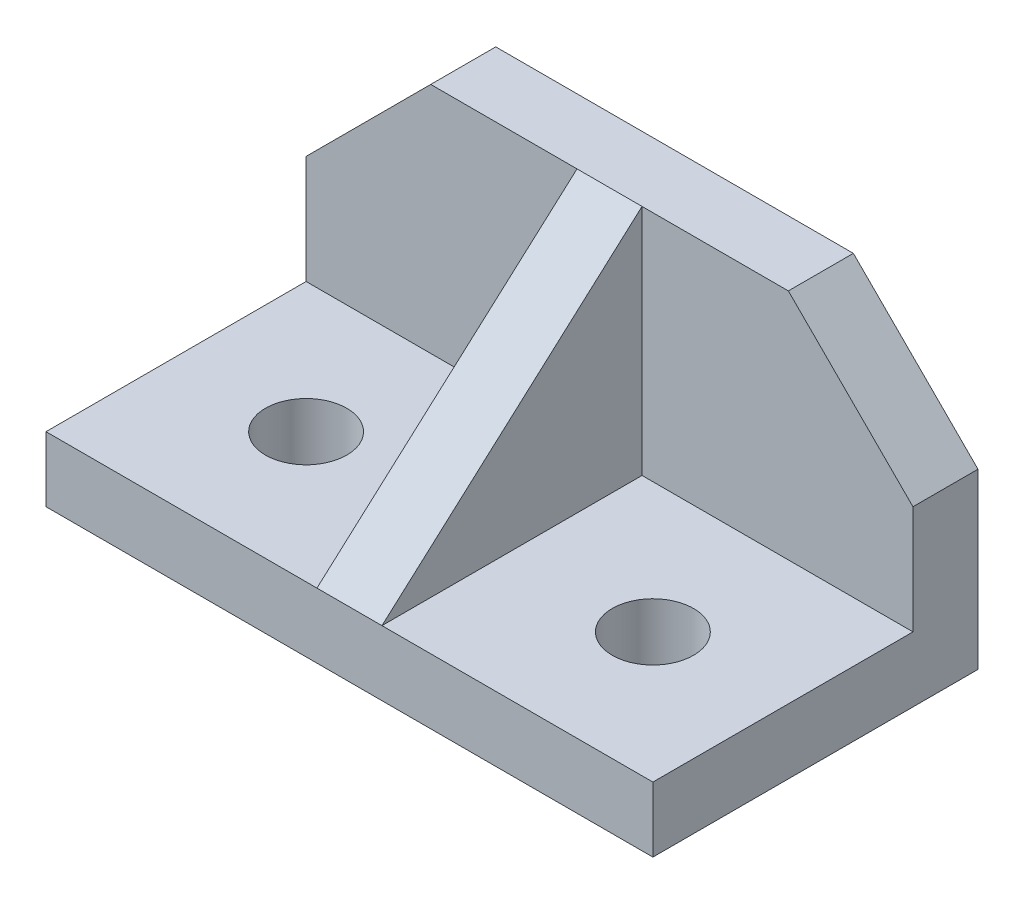
ISO-10303-21;
HEADER;
FILE_DESCRIPTION(('STEP AP214'),'2;1');
FILE_NAME('part.step','',(''),(''),'','','');
FILE_SCHEMA(('AUTOMOTIVE_DESIGN { 1 0 10303 214 1 1 1 1 }'));
ENDSEC;
DATA;
#1=APPLICATION_CONTEXT('core data for automotive mechanical design processes');
#2=APPLICATION_PROTOCOL_DEFINITION('international standard','automotive_design',2000,#1);
#3=PRODUCT_CONTEXT('',#1,'mechanical');
#4=PRODUCT('Part','Part','',(#3));
#5=PRODUCT_RELATED_PRODUCT_CATEGORY('part','',(#4));
#6=PRODUCT_DEFINITION_FORMATION('','',#4);
#7=PRODUCT_DEFINITION_CONTEXT('part definition',#1,'design');
#8=PRODUCT_DEFINITION('design','',#6,#7);
#9=PRODUCT_DEFINITION_SHAPE('','',#8);
#10=(LENGTH_UNIT() NAMED_UNIT(*) SI_UNIT(.MILLI.,.METRE.));
#11=(NAMED_UNIT(*) PLANE_ANGLE_UNIT() SI_UNIT($,.RADIAN.));
#12=(NAMED_UNIT(*) SI_UNIT($,.STERADIAN.) SOLID_ANGLE_UNIT());
#13=UNCERTAINTY_MEASURE_WITH_UNIT(LENGTH_MEASURE(1.E-05),#10,'distance_accuracy_value','');
#14=(GEOMETRIC_REPRESENTATION_CONTEXT(3) GLOBAL_UNCERTAINTY_ASSIGNED_CONTEXT((#13)) GLOBAL_UNIT_ASSIGNED_CONTEXT((#10,
#11,#12)) REPRESENTATION_CONTEXT('',''));
#15=CARTESIAN_POINT('',(0.,0.,0.));
#16=DIRECTION('',(0.,0.,1.));
#17=DIRECTION('',(1.,0.,0.));
#18=AXIS2_PLACEMENT_3D('',#15,#16,#17);
#19=CARTESIAN_POINT('',(0.,12.,48.));
#20=DIRECTION('',(0.,0.,-1.));
#21=DIRECTION('',(-1.,0.,0.));
#22=AXIS2_PLACEMENT_3D('',#19,#20,#21);
#23=PLANE('',#22);
#24=DIRECTION('',(1.,0.,0.));
#25=VECTOR('',#24,1.);
#26=CARTESIAN_POINT('',(-138.065197252365,12.,48.));
#27=LINE('',#26,#25);
#28=CARTESIAN_POINT('',(50.,12.,48.));
#29=VERTEX_POINT('',#28);
#30=CARTESIAN_POINT('',(62.,12.,48.));
#31=VERTEX_POINT('',#30);
#32=EDGE_CURVE('E163',#29,#31,#27,.T.);
#33=ORIENTED_EDGE('',*,*,#32,.F.);
#34=DIRECTION('',(1.,0.,0.));
#35=VECTOR('',#34,1.);
#36=CARTESIAN_POINT('',(0.,12.,48.));
#37=LINE('',#36,#35);
#38=CARTESIAN_POINT('',(0.,12.,48.));
#39=VERTEX_POINT('',#38);
#40=EDGE_CURVE('E87',#39,#29,#37,.T.);
#41=ORIENTED_EDGE('',*,*,#40,.F.);
#42=DIRECTION('',(0.,-1.,0.));
#43=VECTOR('',#42,1.);
#44=CARTESIAN_POINT('',(0.,12.,48.));
#45=LINE('',#44,#43);
#46=CARTESIAN_POINT('',(0.,0.,48.));
#47=VERTEX_POINT('',#46);
#48=EDGE_CURVE('E48',#39,#47,#45,.T.);
#49=ORIENTED_EDGE('',*,*,#48,.T.);
#50=DIRECTION('',(1.,0.,0.));
#51=VECTOR('',#50,1.);
#52=CARTESIAN_POINT('',(0.,0.,48.));
#53=LINE('',#52,#51);
#54=CARTESIAN_POINT('',(112.,0.,48.));
#55=VERTEX_POINT('',#54);
#56=EDGE_CURVE('E259',#47,#55,#53,.T.);
#57=ORIENTED_EDGE('',*,*,#56,.T.);
#58=DIRECTION('',(0.,-1.,0.));
#59=VECTOR('',#58,1.);
#60=CARTESIAN_POINT('',(112.,12.,48.));
#61=LINE('',#60,#59);
#62=CARTESIAN_POINT('',(112.,12.,48.));
#63=VERTEX_POINT('',#62);
#64=EDGE_CURVE('E80',#63,#55,#61,.T.);
#65=ORIENTED_EDGE('',*,*,#64,.F.);
#66=EDGE_CURVE('E237',#31,#63,#37,.T.);
#67=ORIENTED_EDGE('',*,*,#66,.F.);
#68=EDGE_LOOP('',(#33,#41,#49,#57,#65,#67));
#69=FACE_BOUND('',#68,.T.);
#70=ADVANCED_FACE('F39',(#69),#23,.F.);
#71=CARTESIAN_POINT('',(62.,12.,48.));
#72=DIRECTION('',(-1.,0.,0.));
#73=DIRECTION('',(0.,0.,1.));
#74=AXIS2_PLACEMENT_3D('',#71,#72,#73);
#75=PLANE('',#74);
#76=DIRECTION('',(0.,0.66724832158524,-0.744835335723058));
#77=VECTOR('',#76,1.);
#78=CARTESIAN_POINT('',(62.,12.,48.));
#79=LINE('',#78,#77);
#80=CARTESIAN_POINT('',(62.,55.,0.));
#81=VERTEX_POINT('',#80);
#82=EDGE_CURVE('E11',#31,#81,#79,.T.);
#83=ORIENTED_EDGE('',*,*,#82,.F.);
#84=DIRECTION('',(0.,0.,-1.));
#85=VECTOR('',#84,1.);
#86=CARTESIAN_POINT('',(62.,12.,48.));
#87=LINE('',#86,#85);
#88=CARTESIAN_POINT('',(62.,12.,0.));
#89=VERTEX_POINT('',#88);
#90=EDGE_CURVE('E152',#31,#89,#87,.T.);
#91=ORIENTED_EDGE('',*,*,#90,.T.);
#92=DIRECTION('',(0.,1.,0.));
#93=VECTOR('',#92,1.);
#94=CARTESIAN_POINT('',(62.,12.,0.));
#95=LINE('',#94,#93);
#96=EDGE_CURVE('E137',#89,#81,#95,.T.);
#97=ORIENTED_EDGE('',*,*,#96,.T.);
#98=EDGE_LOOP('',(#83,#91,#97));
#99=FACE_BOUND('',#98,.T.);
#100=ADVANCED_FACE('F150',(#99),#75,.F.);
#101=CARTESIAN_POINT('',(0.,12.,0.));
#102=DIRECTION('',(0.,1.,0.));
#103=DIRECTION('',(0.,0.,1.));
#104=AXIS2_PLACEMENT_3D('',#101,#102,#103);
#105=PLANE('',#104);
#106=CARTESIAN_POINT('',(88.,12.,24.));
#107=DIRECTION('',(0.,1.,0.));
#108=DIRECTION('',(0.,0.,1.));
#109=AXIS2_PLACEMENT_3D('',#106,#107,#108);
#110=CIRCLE('',#109,7.5);
#111=CARTESIAN_POINT('',(88.,12.,31.5));
#112=VERTEX_POINT('',#111);
#113=EDGE_CURVE('E248',#112,#112,#110,.T.);
#114=ORIENTED_EDGE('',*,*,#113,.F.);
#115=EDGE_LOOP('',(#114));
#116=FACE_BOUND('',#115,.T.);
#117=DIRECTION('',(1.,0.,0.));
#118=VECTOR('',#117,1.);
#119=CARTESIAN_POINT('',(0.,12.,0.));
#120=LINE('',#119,#118);
#121=CARTESIAN_POINT('',(112.,12.,0.));
#122=VERTEX_POINT('',#121);
#123=EDGE_CURVE('E243',#89,#122,#120,.T.);
#124=ORIENTED_EDGE('',*,*,#123,.F.);
#125=ORIENTED_EDGE('',*,*,#90,.F.);
#126=ORIENTED_EDGE('',*,*,#66,.T.);
#127=DIRECTION('',(0.,0.,1.));
#128=VECTOR('',#127,1.);
#129=CARTESIAN_POINT('',(112.,12.,0.));
#130=LINE('',#129,#128);
#131=EDGE_CURVE('E240',#122,#63,#130,.T.);
#132=ORIENTED_EDGE('',*,*,#131,.F.);
#133=EDGE_LOOP('',(#124,#125,#126,#132));
#134=FACE_BOUND('',#133,.T.);
#135=ADVANCED_FACE('F291',(#116,#134),#105,.T.);
#136=CARTESIAN_POINT('',(24.,12.,24.));
#137=DIRECTION('',(0.,1.,0.));
#138=DIRECTION('',(0.,0.,1.));
#139=AXIS2_PLACEMENT_3D('',#136,#137,#138);
#140=CIRCLE('',#139,7.5);
#141=CARTESIAN_POINT('',(24.,12.,31.5));
#142=VERTEX_POINT('',#141);
#143=EDGE_CURVE('E230',#142,#142,#140,.T.);
#144=ORIENTED_EDGE('',*,*,#143,.F.);
#145=EDGE_LOOP('',(#144));
#146=FACE_BOUND('',#145,.T.);
#147=ORIENTED_EDGE('',*,*,#40,.T.);
#148=DIRECTION('',(0.,0.,-1.));
#149=VECTOR('',#148,1.);
#150=CARTESIAN_POINT('',(50.,12.,48.));
#151=LINE('',#150,#149);
#152=CARTESIAN_POINT('',(50.,12.,0.));
#153=VERTEX_POINT('',#152);
#154=EDGE_CURVE('E147',#29,#153,#151,.T.);
#155=ORIENTED_EDGE('',*,*,#154,.T.);
#156=CARTESIAN_POINT('',(0.,12.,0.));
#157=VERTEX_POINT('',#156);
#158=EDGE_CURVE('E244',#157,#153,#120,.T.);
#159=ORIENTED_EDGE('',*,*,#158,.F.);
#160=DIRECTION('',(0.,0.,1.));
#161=VECTOR('',#160,1.);
#162=CARTESIAN_POINT('',(0.,12.,0.));
#163=LINE('',#162,#161);
#164=EDGE_CURVE('E64',#157,#39,#163,.T.);
#165=ORIENTED_EDGE('',*,*,#164,.T.);
#166=EDGE_LOOP('',(#147,#155,#159,#165));
#167=FACE_BOUND('',#166,.T.);
#168=ADVANCED_FACE('F294',(#146,#167),#105,.T.);
#169=CARTESIAN_POINT('',(0.,0.,0.));
#170=DIRECTION('',(0.,0.,1.));
#171=DIRECTION('',(1.,0.,0.));
#172=AXIS2_PLACEMENT_3D('',#169,#170,#171);
#173=PLANE('',#172);
#174=DIRECTION('',(1.,0.,0.));
#175=VECTOR('',#174,1.);
#176=CARTESIAN_POINT('',(23.0000000000002,55.,0.));
#177=LINE('',#176,#175);
#178=CARTESIAN_POINT('',(88.9999999999998,55.,0.));
#179=VERTEX_POINT('',#178);
#180=EDGE_CURVE('E134',#81,#179,#177,.T.);
#181=ORIENTED_EDGE('',*,*,#180,.F.);
#182=ORIENTED_EDGE('',*,*,#96,.F.);
#183=ORIENTED_EDGE('',*,*,#123,.T.);
#184=DIRECTION('',(0.,1.,0.));
#185=VECTOR('',#184,1.);
#186=CARTESIAN_POINT('',(112.,0.,0.));
#187=LINE('',#186,#185);
#188=CARTESIAN_POINT('',(112.,32.,0.));
#189=VERTEX_POINT('',#188);
#190=EDGE_CURVE('E207',#122,#189,#187,.T.);
#191=ORIENTED_EDGE('',*,*,#190,.T.);
#192=DIRECTION('',(0.707106781186551,-0.707106781186544,0.));
#193=VECTOR('',#192,1.);
#194=CARTESIAN_POINT('',(88.9999999999998,55.,0.));
#195=LINE('',#194,#193);
#196=EDGE_CURVE('E140',#179,#189,#195,.T.);
#197=ORIENTED_EDGE('',*,*,#196,.F.);
#198=EDGE_LOOP('',(#181,#182,#183,#191,#197));
#199=FACE_BOUND('',#198,.T.);
#200=ADVANCED_FACE('F136',(#199),#173,.T.);
#201=ORIENTED_EDGE('',*,*,#158,.T.);
#202=DIRECTION('',(0.,-1.,0.));
#203=VECTOR('',#202,1.);
#204=CARTESIAN_POINT('',(50.,12.,0.));
#205=LINE('',#204,#203);
#206=CARTESIAN_POINT('',(50.,55.,0.));
#207=VERTEX_POINT('',#206);
#208=EDGE_CURVE('E154',#207,#153,#205,.T.);
#209=ORIENTED_EDGE('',*,*,#208,.F.);
#210=CARTESIAN_POINT('',(23.0000000000002,55.,0.));
#211=VERTEX_POINT('',#210);
#212=EDGE_CURVE('E146',#211,#207,#177,.T.);
#213=ORIENTED_EDGE('',*,*,#212,.F.);
#214=DIRECTION('',(-0.707106781186551,-0.707106781186544,0.));
#215=VECTOR('',#214,1.);
#216=CARTESIAN_POINT('',(23.0000000000002,55.,0.));
#217=LINE('',#216,#215);
#218=CARTESIAN_POINT('',(0.,32.,0.));
#219=VERTEX_POINT('',#218);
#220=EDGE_CURVE('E185',#211,#219,#217,.T.);
#221=ORIENTED_EDGE('',*,*,#220,.T.);
#222=DIRECTION('',(0.,1.,0.));
#223=VECTOR('',#222,1.);
#224=CARTESIAN_POINT('',(0.,0.,0.));
#225=LINE('',#224,#223);
#226=EDGE_CURVE('E210',#157,#219,#225,.T.);
#227=ORIENTED_EDGE('',*,*,#226,.F.);
#228=EDGE_LOOP('',(#201,#209,#213,#221,#227));
#229=FACE_BOUND('',#228,.T.);
#230=ADVANCED_FACE('F313',(#229),#173,.T.);
#231=CARTESIAN_POINT('',(0.,12.,0.));
#232=DIRECTION('',(1.,0.,0.));
#233=DIRECTION('',(0.,0.,-1.));
#234=AXIS2_PLACEMENT_3D('',#231,#232,#233);
#235=PLANE('',#234);
#236=DIRECTION('',(0.,0.,1.));
#237=VECTOR('',#236,1.);
#238=CARTESIAN_POINT('',(0.,0.,0.));
#239=LINE('',#238,#237);
#240=CARTESIAN_POINT('',(0.,0.,-12.));
#241=VERTEX_POINT('',#240);
#242=EDGE_CURVE('E255',#241,#47,#239,.T.);
#243=ORIENTED_EDGE('',*,*,#242,.T.);
#244=ORIENTED_EDGE('',*,*,#48,.F.);
#245=ORIENTED_EDGE('',*,*,#164,.F.);
#246=ORIENTED_EDGE('',*,*,#226,.T.);
#247=DIRECTION('',(0.,0.,1.));
#248=VECTOR('',#247,1.);
#249=CARTESIAN_POINT('',(0.,32.,-12.));
#250=LINE('',#249,#248);
#251=CARTESIAN_POINT('',(0.,32.,-12.));
#252=VERTEX_POINT('',#251);
#253=EDGE_CURVE('E218',#252,#219,#250,.T.);
#254=ORIENTED_EDGE('',*,*,#253,.F.);
#255=DIRECTION('',(0.,1.,0.));
#256=VECTOR('',#255,1.);
#257=CARTESIAN_POINT('',(0.,0.,-12.));
#258=LINE('',#257,#256);
#259=EDGE_CURVE('E196',#241,#252,#258,.T.);
#260=ORIENTED_EDGE('',*,*,#259,.F.);
#261=EDGE_LOOP('',(#243,#244,#245,#246,#254,#260));
#262=FACE_BOUND('',#261,.T.);
#263=ADVANCED_FACE('F272',(#262),#235,.F.);
#264=CARTESIAN_POINT('',(112.,12.,0.));
#265=DIRECTION('',(1.,0.,0.));
#266=DIRECTION('',(0.,0.,-1.));
#267=AXIS2_PLACEMENT_3D('',#264,#265,#266);
#268=PLANE('',#267);
#269=DIRECTION('',(0.,0.,1.));
#270=VECTOR('',#269,1.);
#271=CARTESIAN_POINT('',(112.,0.,0.));
#272=LINE('',#271,#270);
#273=CARTESIAN_POINT('',(112.,0.,-12.));
#274=VERTEX_POINT('',#273);
#275=EDGE_CURVE('E262',#274,#55,#272,.T.);
#276=ORIENTED_EDGE('',*,*,#275,.F.);
#277=DIRECTION('',(0.,1.,0.));
#278=VECTOR('',#277,1.);
#279=CARTESIAN_POINT('',(112.,0.,-12.));
#280=LINE('',#279,#278);
#281=CARTESIAN_POINT('',(112.,32.,-12.));
#282=VERTEX_POINT('',#281);
#283=EDGE_CURVE('E188',#274,#282,#280,.T.);
#284=ORIENTED_EDGE('',*,*,#283,.T.);
#285=DIRECTION('',(0.,0.,1.));
#286=VECTOR('',#285,1.);
#287=CARTESIAN_POINT('',(112.,32.,-12.));
#288=LINE('',#287,#286);
#289=EDGE_CURVE('E222',#282,#189,#288,.T.);
#290=ORIENTED_EDGE('',*,*,#289,.T.);
#291=ORIENTED_EDGE('',*,*,#190,.F.);
#292=ORIENTED_EDGE('',*,*,#131,.T.);
#293=ORIENTED_EDGE('',*,*,#64,.T.);
#294=EDGE_LOOP('',(#276,#284,#290,#291,#292,#293));
#295=FACE_BOUND('',#294,.T.);
#296=ADVANCED_FACE('F279',(#295),#268,.T.);
#297=CARTESIAN_POINT('',(24.,12.,24.));
#298=DIRECTION('',(0.,-1.,0.));
#299=DIRECTION('',(0.,0.,-1.));
#300=AXIS2_PLACEMENT_3D('',#297,#298,#299);
#301=CYLINDRICAL_SURFACE('',#300,7.5);
#302=ORIENTED_EDGE('',*,*,#143,.T.);
#303=EDGE_LOOP('',(#302));
#304=FACE_BOUND('',#303,.T.);
#305=CARTESIAN_POINT('',(24.,0.,24.));
#306=DIRECTION('',(0.,1.,0.));
#307=DIRECTION('',(0.,0.,1.));
#308=AXIS2_PLACEMENT_3D('',#305,#306,#307);
#309=CIRCLE('',#308,7.5);
#310=CARTESIAN_POINT('',(24.,0.,31.5));
#311=VERTEX_POINT('',#310);
#312=EDGE_CURVE('E229',#311,#311,#309,.T.);
#313=ORIENTED_EDGE('',*,*,#312,.F.);
#314=EDGE_LOOP('',(#313));
#315=FACE_BOUND('',#314,.T.);
#316=ADVANCED_FACE('F41',(#304,#315),#301,.F.);
#317=CARTESIAN_POINT('',(88.,12.,24.));
#318=DIRECTION('',(0.,-1.,0.));
#319=DIRECTION('',(0.,0.,-1.));
#320=AXIS2_PLACEMENT_3D('',#317,#318,#319);
#321=CYLINDRICAL_SURFACE('',#320,7.5);
#322=ORIENTED_EDGE('',*,*,#113,.T.);
#323=EDGE_LOOP('',(#322));
#324=FACE_BOUND('',#323,.T.);
#325=CARTESIAN_POINT('',(88.,0.,24.));
#326=DIRECTION('',(0.,1.,0.));
#327=DIRECTION('',(0.,0.,1.));
#328=AXIS2_PLACEMENT_3D('',#325,#326,#327);
#329=CIRCLE('',#328,7.5);
#330=CARTESIAN_POINT('',(88.,0.,31.5));
#331=VERTEX_POINT('',#330);
#332=EDGE_CURVE('E234',#331,#331,#329,.T.);
#333=ORIENTED_EDGE('',*,*,#332,.F.);
#334=EDGE_LOOP('',(#333));
#335=FACE_BOUND('',#334,.T.);
#336=ADVANCED_FACE('F334',(#324,#335),#321,.F.);
#337=CARTESIAN_POINT('',(0.,0.,0.));
#338=DIRECTION('',(0.,1.,0.));
#339=DIRECTION('',(0.,0.,1.));
#340=AXIS2_PLACEMENT_3D('',#337,#338,#339);
#341=PLANE('',#340);
#342=ORIENTED_EDGE('',*,*,#312,.T.);
#343=EDGE_LOOP('',(#342));
#344=FACE_BOUND('',#343,.T.);
#345=ORIENTED_EDGE('',*,*,#242,.F.);
#346=DIRECTION('',(1.,0.,0.));
#347=VECTOR('',#346,1.);
#348=CARTESIAN_POINT('',(0.,0.,-12.));
#349=LINE('',#348,#347);
#350=EDGE_CURVE('E192',#241,#274,#349,.T.);
#351=ORIENTED_EDGE('',*,*,#350,.T.);
#352=ORIENTED_EDGE('',*,*,#275,.T.);
#353=ORIENTED_EDGE('',*,*,#56,.F.);
#354=EDGE_LOOP('',(#345,#351,#352,#353));
#355=FACE_BOUND('',#354,.T.);
#356=ORIENTED_EDGE('',*,*,#332,.T.);
#357=EDGE_LOOP('',(#356));
#358=FACE_BOUND('',#357,.T.);
#359=ADVANCED_FACE('F276',(#344,#355,#358),#341,.F.);
#360=CARTESIAN_POINT('',(23.0000000000002,55.,-12.));
#361=DIRECTION('',(0.,-1.,0.));
#362=DIRECTION('',(0.,0.,-1.));
#363=AXIS2_PLACEMENT_3D('',#360,#361,#362);
#364=PLANE('',#363);
#365=ORIENTED_EDGE('',*,*,#212,.T.);
#366=DIRECTION('',(1.,0.,0.));
#367=VECTOR('',#366,1.);
#368=CARTESIAN_POINT('',(-138.065197252365,55.,0.));
#369=LINE('',#368,#367);
#370=EDGE_CURVE('E155',#207,#81,#369,.T.);
#371=ORIENTED_EDGE('',*,*,#370,.T.);
#372=ORIENTED_EDGE('',*,*,#180,.T.);
#373=DIRECTION('',(0.,0.,1.));
#374=VECTOR('',#373,1.);
#375=CARTESIAN_POINT('',(88.9999999999998,55.,-12.));
#376=LINE('',#375,#374);
#377=CARTESIAN_POINT('',(88.9999999999998,55.,-12.));
#378=VERTEX_POINT('',#377);
#379=EDGE_CURVE('E226',#378,#179,#376,.T.);
#380=ORIENTED_EDGE('',*,*,#379,.F.);
#381=DIRECTION('',(1.,0.,0.));
#382=VECTOR('',#381,1.);
#383=CARTESIAN_POINT('',(23.0000000000002,55.,-12.));
#384=LINE('',#383,#382);
#385=CARTESIAN_POINT('',(23.0000000000002,55.,-12.));
#386=VERTEX_POINT('',#385);
#387=EDGE_CURVE('E180',#386,#378,#384,.T.);
#388=ORIENTED_EDGE('',*,*,#387,.F.);
#389=DIRECTION('',(0.,0.,1.));
#390=VECTOR('',#389,1.);
#391=CARTESIAN_POINT('',(23.0000000000002,55.,-12.));
#392=LINE('',#391,#390);
#393=EDGE_CURVE('E202',#386,#211,#392,.T.);
#394=ORIENTED_EDGE('',*,*,#393,.T.);
#395=EDGE_LOOP('',(#365,#371,#372,#380,#388,#394));
#396=FACE_BOUND('',#395,.T.);
#397=ADVANCED_FACE('F159',(#396),#364,.F.);
#398=CARTESIAN_POINT('',(88.9999999999998,55.,-12.));
#399=DIRECTION('',(-0.707106781186544,-0.707106781186551,0.));
#400=DIRECTION('',(0.707106781186551,-0.707106781186544,0.));
#401=AXIS2_PLACEMENT_3D('',#398,#399,#400);
#402=PLANE('',#401);
#403=ORIENTED_EDGE('',*,*,#196,.T.);
#404=ORIENTED_EDGE('',*,*,#289,.F.);
#405=DIRECTION('',(0.707106781186551,-0.707106781186544,0.));
#406=VECTOR('',#405,1.);
#407=CARTESIAN_POINT('',(88.9999999999998,55.,-12.));
#408=LINE('',#407,#406);
#409=EDGE_CURVE('E184',#378,#282,#408,.T.);
#410=ORIENTED_EDGE('',*,*,#409,.F.);
#411=ORIENTED_EDGE('',*,*,#379,.T.);
#412=EDGE_LOOP('',(#403,#404,#410,#411));
#413=FACE_BOUND('',#412,.T.);
#414=ADVANCED_FACE('F286',(#413),#402,.F.);
#415=CARTESIAN_POINT('',(23.0000000000002,55.,-12.));
#416=DIRECTION('',(-0.707106781186544,0.707106781186551,0.));
#417=DIRECTION('',(-0.707106781186551,-0.707106781186544,0.));
#418=AXIS2_PLACEMENT_3D('',#415,#416,#417);
#419=PLANE('',#418);
#420=ORIENTED_EDGE('',*,*,#220,.F.);
#421=ORIENTED_EDGE('',*,*,#393,.F.);
#422=DIRECTION('',(-0.707106781186551,-0.707106781186544,0.));
#423=VECTOR('',#422,1.);
#424=CARTESIAN_POINT('',(23.0000000000002,55.,-12.));
#425=LINE('',#424,#423);
#426=EDGE_CURVE('E199',#386,#252,#425,.T.);
#427=ORIENTED_EDGE('',*,*,#426,.T.);
#428=ORIENTED_EDGE('',*,*,#253,.T.);
#429=EDGE_LOOP('',(#420,#421,#427,#428));
#430=FACE_BOUND('',#429,.T.);
#431=ADVANCED_FACE('F325',(#430),#419,.T.);
#432=CARTESIAN_POINT('',(0.,0.,-12.));
#433=DIRECTION('',(0.,0.,1.));
#434=DIRECTION('',(1.,0.,0.));
#435=AXIS2_PLACEMENT_3D('',#432,#433,#434);
#436=PLANE('',#435);
#437=ORIENTED_EDGE('',*,*,#387,.T.);
#438=ORIENTED_EDGE('',*,*,#409,.T.);
#439=ORIENTED_EDGE('',*,*,#283,.F.);
#440=ORIENTED_EDGE('',*,*,#350,.F.);
#441=ORIENTED_EDGE('',*,*,#259,.T.);
#442=ORIENTED_EDGE('',*,*,#426,.F.);
#443=EDGE_LOOP('',(#437,#438,#439,#440,#441,#442));
#444=FACE_BOUND('',#443,.T.);
#445=ADVANCED_FACE('F281',(#444),#436,.F.);
#446=CARTESIAN_POINT('',(50.,12.,48.));
#447=DIRECTION('',(1.,0.,0.));
#448=DIRECTION('',(0.,0.,-1.));
#449=AXIS2_PLACEMENT_3D('',#446,#447,#448);
#450=PLANE('',#449);
#451=ORIENTED_EDGE('',*,*,#154,.F.);
#452=DIRECTION('',(0.,0.66724832158524,-0.744835335723058));
#453=VECTOR('',#452,1.);
#454=CARTESIAN_POINT('',(50.,55.,0.));
#455=LINE('',#454,#453);
#456=EDGE_CURVE('E55',#29,#207,#455,.T.);
#457=ORIENTED_EDGE('',*,*,#456,.T.);
#458=ORIENTED_EDGE('',*,*,#208,.T.);
#459=EDGE_LOOP('',(#451,#457,#458));
#460=FACE_BOUND('',#459,.T.);
#461=ADVANCED_FACE('F350',(#460),#450,.F.);
#462=CARTESIAN_POINT('',(-138.065197252365,55.,0.));
#463=DIRECTION('',(0.,0.744835335723058,0.66724832158524));
#464=DIRECTION('',(0.,-0.66724832158524,0.744835335723058));
#465=AXIS2_PLACEMENT_3D('',#462,#463,#464);
#466=PLANE('',#465);
#467=ORIENTED_EDGE('',*,*,#32,.T.);
#468=ORIENTED_EDGE('',*,*,#82,.T.);
#469=ORIENTED_EDGE('',*,*,#370,.F.);
#470=ORIENTED_EDGE('',*,*,#456,.F.);
#471=EDGE_LOOP('',(#467,#468,#469,#470));
#472=FACE_BOUND('',#471,.T.);
#473=ADVANCED_FACE('F166',(#472),#466,.T.);
#474=CLOSED_SHELL('',(#70,#100,#135,#168,#200,#230,#263,#296,#316,#336,#359,#397,#414,#431,#445,
#461,#473));
#475=MANIFOLD_SOLID_BREP('B2',#474);
#476=ADVANCED_BREP_SHAPE_REPRESENTATION('',(#18,#475),#14);
#477=SHAPE_DEFINITION_REPRESENTATION(#9,#476);
ENDSEC;
END-ISO-10303-21;
